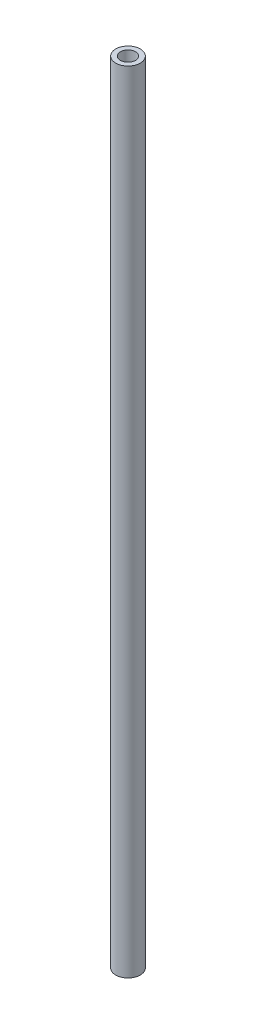
ISO-10303-21;
HEADER;
FILE_DESCRIPTION(('STEP AP214'),'2;1');
FILE_NAME('part.step','',(''),(''),'','','');
FILE_SCHEMA(('AUTOMOTIVE_DESIGN { 1 0 10303 214 1 1 1 1 }'));
ENDSEC;
DATA;
#1=APPLICATION_CONTEXT('core data for automotive mechanical design processes');
#2=APPLICATION_PROTOCOL_DEFINITION('international standard','automotive_design',2000,#1);
#3=PRODUCT_CONTEXT('',#1,'mechanical');
#4=PRODUCT('Part','Part','',(#3));
#5=PRODUCT_RELATED_PRODUCT_CATEGORY('part','',(#4));
#6=PRODUCT_DEFINITION_FORMATION('','',#4);
#7=PRODUCT_DEFINITION_CONTEXT('part definition',#1,'design');
#8=PRODUCT_DEFINITION('design','',#6,#7);
#9=PRODUCT_DEFINITION_SHAPE('','',#8);
#10=(LENGTH_UNIT() NAMED_UNIT(*) SI_UNIT(.MILLI.,.METRE.));
#11=(NAMED_UNIT(*) PLANE_ANGLE_UNIT() SI_UNIT($,.RADIAN.));
#12=(NAMED_UNIT(*) SI_UNIT($,.STERADIAN.) SOLID_ANGLE_UNIT());
#13=UNCERTAINTY_MEASURE_WITH_UNIT(LENGTH_MEASURE(1.E-05),#10,'distance_accuracy_value','');
#14=(GEOMETRIC_REPRESENTATION_CONTEXT(3) GLOBAL_UNCERTAINTY_ASSIGNED_CONTEXT((#13)) GLOBAL_UNIT_ASSIGNED_CONTEXT((#10,
#11,#12)) REPRESENTATION_CONTEXT('',''));
#15=CARTESIAN_POINT('',(0.,0.,0.));
#16=DIRECTION('',(0.,0.,1.));
#17=DIRECTION('',(1.,0.,0.));
#18=AXIS2_PLACEMENT_3D('',#15,#16,#17);
#19=CARTESIAN_POINT('',(0.,318.399999978,0.));
#20=DIRECTION('',(0.,1.,0.));
#21=DIRECTION('',(0.,0.,1.));
#22=AXIS2_PLACEMENT_3D('',#19,#20,#21);
#23=PLANE('',#22);
#24=CARTESIAN_POINT('',(0.,318.399999978,0.));
#25=DIRECTION('',(0.,1.,0.));
#26=DIRECTION('',(0.,0.,1.));
#27=AXIS2_PLACEMENT_3D('',#24,#25,#26);
#28=CIRCLE('',#27,4.953);
#29=CARTESIAN_POINT('',(0.,318.399999978,4.953));
#30=VERTEX_POINT('',#29);
#31=EDGE_CURVE('E10',#30,#30,#28,.T.);
#32=ORIENTED_EDGE('',*,*,#31,.T.);
#33=EDGE_LOOP('',(#32));
#34=FACE_BOUND('',#33,.T.);
#35=CARTESIAN_POINT('',(0.,318.399999978,0.));
#36=DIRECTION('',(0.,1.,0.));
#37=DIRECTION('',(0.,0.,1.));
#38=AXIS2_PLACEMENT_3D('',#35,#36,#37);
#39=CIRCLE('',#38,3.048);
#40=CARTESIAN_POINT('',(0.,318.399999978,3.048));
#41=VERTEX_POINT('',#40);
#42=EDGE_CURVE('E50',#41,#41,#39,.T.);
#43=ORIENTED_EDGE('',*,*,#42,.F.);
#44=EDGE_LOOP('',(#43));
#45=FACE_BOUND('',#44,.T.);
#46=ADVANCED_FACE('F39',(#34,#45),#23,.T.);
#47=CARTESIAN_POINT('',(0.,0.,0.));
#48=DIRECTION('',(0.,1.,0.));
#49=DIRECTION('',(0.,0.,1.));
#50=AXIS2_PLACEMENT_3D('',#47,#48,#49);
#51=PLANE('',#50);
#52=CARTESIAN_POINT('',(0.,0.,0.));
#53=DIRECTION('',(0.,1.,0.));
#54=DIRECTION('',(0.,0.,1.));
#55=AXIS2_PLACEMENT_3D('',#52,#53,#54);
#56=CIRCLE('',#55,4.953);
#57=CARTESIAN_POINT('',(0.,0.,4.953));
#58=VERTEX_POINT('',#57);
#59=EDGE_CURVE('E43',#58,#58,#56,.T.);
#60=ORIENTED_EDGE('',*,*,#59,.F.);
#61=EDGE_LOOP('',(#60));
#62=FACE_BOUND('',#61,.T.);
#63=CARTESIAN_POINT('',(0.,0.,0.));
#64=DIRECTION('',(0.,1.,0.));
#65=DIRECTION('',(0.,0.,1.));
#66=AXIS2_PLACEMENT_3D('',#63,#64,#65);
#67=CIRCLE('',#66,3.048);
#68=CARTESIAN_POINT('',(0.,0.,3.048));
#69=VERTEX_POINT('',#68);
#70=EDGE_CURVE('E52',#69,#69,#67,.T.);
#71=ORIENTED_EDGE('',*,*,#70,.T.);
#72=EDGE_LOOP('',(#71));
#73=FACE_BOUND('',#72,.T.);
#74=ADVANCED_FACE('F62',(#62,#73),#51,.F.);
#75=CARTESIAN_POINT('',(0.,318.399999978,0.));
#76=DIRECTION('',(0.,-1.,0.));
#77=DIRECTION('',(0.,0.,-1.));
#78=AXIS2_PLACEMENT_3D('',#75,#76,#77);
#79=CYLINDRICAL_SURFACE('',#78,4.953);
#80=ORIENTED_EDGE('',*,*,#31,.F.);
#81=EDGE_LOOP('',(#80));
#82=FACE_BOUND('',#81,.T.);
#83=ORIENTED_EDGE('',*,*,#59,.T.);
#84=EDGE_LOOP('',(#83));
#85=FACE_BOUND('',#84,.T.);
#86=ADVANCED_FACE('F41',(#82,#85),#79,.T.);
#87=CARTESIAN_POINT('',(0.,318.399999978,0.));
#88=DIRECTION('',(0.,-1.,0.));
#89=DIRECTION('',(0.,0.,-1.));
#90=AXIS2_PLACEMENT_3D('',#87,#88,#89);
#91=CYLINDRICAL_SURFACE('',#90,3.048);
#92=ORIENTED_EDGE('',*,*,#42,.T.);
#93=EDGE_LOOP('',(#92));
#94=FACE_BOUND('',#93,.T.);
#95=ORIENTED_EDGE('',*,*,#70,.F.);
#96=EDGE_LOOP('',(#95));
#97=FACE_BOUND('',#96,.T.);
#98=ADVANCED_FACE('F58',(#94,#97),#91,.F.);
#99=CLOSED_SHELL('',(#46,#74,#86,#98));
#100=MANIFOLD_SOLID_BREP('B2',#99);
#101=ADVANCED_BREP_SHAPE_REPRESENTATION('',(#18,#100),#14);
#102=SHAPE_DEFINITION_REPRESENTATION(#9,#101);
ENDSEC;
END-ISO-10303-21;
